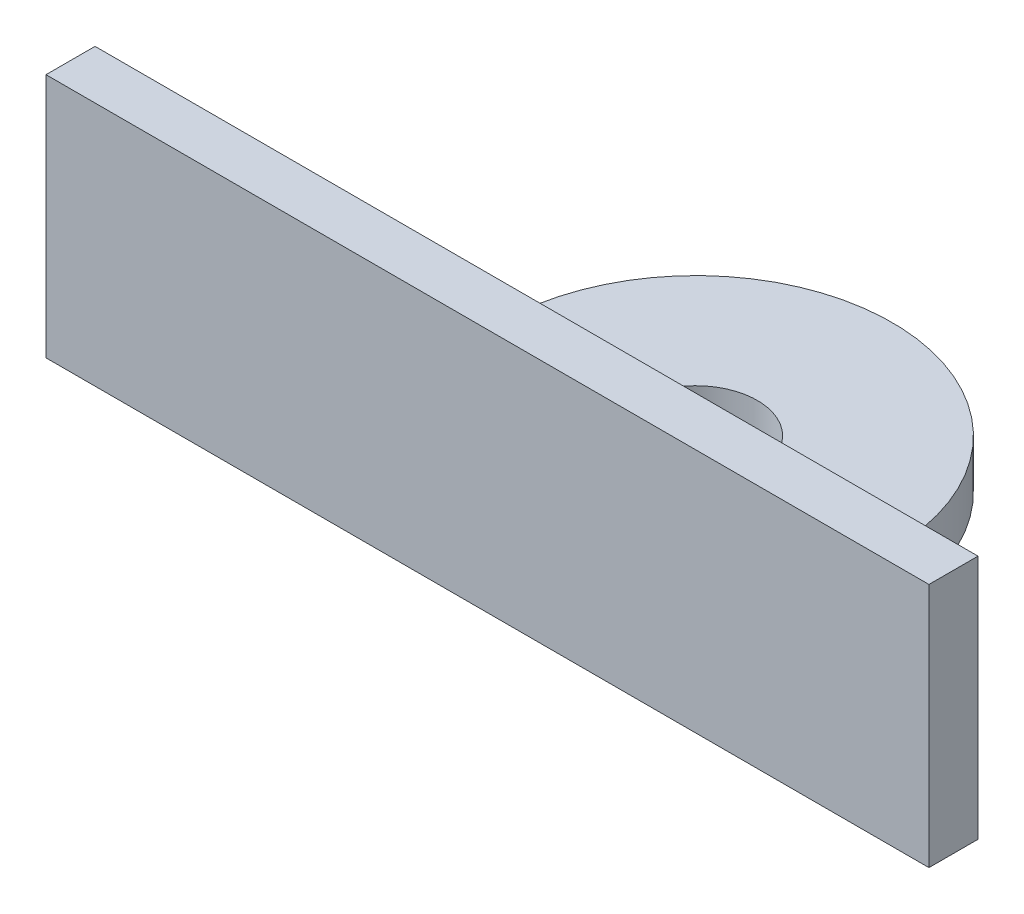
ISO-10303-21;
HEADER;
FILE_DESCRIPTION(('STEP AP214'),'2;1');
FILE_NAME('part.step','',(''),(''),'','','');
FILE_SCHEMA(('AUTOMOTIVE_DESIGN { 1 0 10303 214 1 1 1 1 }'));
ENDSEC;
DATA;
#1=APPLICATION_CONTEXT('core data for automotive mechanical design processes');
#2=APPLICATION_PROTOCOL_DEFINITION('international standard','automotive_design',2000,#1);
#3=PRODUCT_CONTEXT('',#1,'mechanical');
#4=PRODUCT('Part','Part','',(#3));
#5=PRODUCT_RELATED_PRODUCT_CATEGORY('part','',(#4));
#6=PRODUCT_DEFINITION_FORMATION('','',#4);
#7=PRODUCT_DEFINITION_CONTEXT('part definition',#1,'design');
#8=PRODUCT_DEFINITION('design','',#6,#7);
#9=PRODUCT_DEFINITION_SHAPE('','',#8);
#10=(LENGTH_UNIT() NAMED_UNIT(*) SI_UNIT(.MILLI.,.METRE.));
#11=(NAMED_UNIT(*) PLANE_ANGLE_UNIT() SI_UNIT($,.RADIAN.));
#12=(NAMED_UNIT(*) SI_UNIT($,.STERADIAN.) SOLID_ANGLE_UNIT());
#13=UNCERTAINTY_MEASURE_WITH_UNIT(LENGTH_MEASURE(1.E-05),#10,'distance_accuracy_value','');
#14=(GEOMETRIC_REPRESENTATION_CONTEXT(3) GLOBAL_UNCERTAINTY_ASSIGNED_CONTEXT((#13)) GLOBAL_UNIT_ASSIGNED_CONTEXT((#10,
#11,#12)) REPRESENTATION_CONTEXT('',''));
#15=CARTESIAN_POINT('',(0.,0.,0.));
#16=DIRECTION('',(0.,0.,1.));
#17=DIRECTION('',(1.,0.,0.));
#18=AXIS2_PLACEMENT_3D('',#15,#16,#17);
#19=CARTESIAN_POINT('',(0.,10.,-42.5));
#20=DIRECTION('',(0.,1.,0.));
#21=DIRECTION('',(0.,0.,1.));
#22=AXIS2_PLACEMENT_3D('',#19,#20,#21);
#23=PLANE('',#22);
#24=DIRECTION('',(-1.,0.,0.));
#25=VECTOR('',#24,1.);
#26=CARTESIAN_POINT('',(0.,10.,-10.));
#27=LINE('',#26,#25);
#28=CARTESIAN_POINT('',(40.,10.,-10.));
#29=VERTEX_POINT('',#28);
#30=CARTESIAN_POINT('',(-40.,10.,-10.));
#31=VERTEX_POINT('',#30);
#32=EDGE_CURVE('E138',#29,#31,#27,.T.);
#33=ORIENTED_EDGE('',*,*,#32,.F.);
#34=DIRECTION('',(0.,0.,-1.));
#35=VECTOR('',#34,1.);
#36=CARTESIAN_POINT('',(40.,10.,0.));
#37=LINE('',#36,#35);
#38=CARTESIAN_POINT('',(40.,10.,-42.5));
#39=VERTEX_POINT('',#38);
#40=EDGE_CURVE('E152',#29,#39,#37,.T.);
#41=ORIENTED_EDGE('',*,*,#40,.T.);
#42=CARTESIAN_POINT('',(0.,10.,-42.5));
#43=DIRECTION('',(0.,1.,0.));
#44=DIRECTION('',(0.,0.,1.));
#45=AXIS2_PLACEMENT_3D('',#42,#43,#44);
#46=CIRCLE('',#45,40.);
#47=CARTESIAN_POINT('',(-40.,10.,-42.5));
#48=VERTEX_POINT('',#47);
#49=EDGE_CURVE('E155',#39,#48,#46,.T.);
#50=ORIENTED_EDGE('',*,*,#49,.T.);
#51=DIRECTION('',(0.,0.,1.));
#52=VECTOR('',#51,1.);
#53=CARTESIAN_POINT('',(-40.,10.,-42.5));
#54=LINE('',#53,#52);
#55=EDGE_CURVE('E150',#48,#31,#54,.T.);
#56=ORIENTED_EDGE('',*,*,#55,.T.);
#57=EDGE_LOOP('',(#33,#41,#50,#56));
#58=FACE_BOUND('',#57,.T.);
#59=CARTESIAN_POINT('',(0.,10.,-42.5));
#60=DIRECTION('',(0.,1.,0.));
#61=DIRECTION('',(0.,0.,1.));
#62=AXIS2_PLACEMENT_3D('',#59,#60,#61);
#63=CIRCLE('',#62,12.5);
#64=CARTESIAN_POINT('',(0.,10.,-30.));
#65=VERTEX_POINT('',#64);
#66=EDGE_CURVE('E145',#65,#65,#63,.T.);
#67=ORIENTED_EDGE('',*,*,#66,.F.);
#68=EDGE_LOOP('',(#67));
#69=FACE_BOUND('',#68,.T.);
#70=ADVANCED_FACE('F33',(#58,#69),#23,.T.);
#71=CARTESIAN_POINT('',(0.,0.,-42.5));
#72=DIRECTION('',(0.,1.,0.));
#73=DIRECTION('',(0.,0.,1.));
#74=AXIS2_PLACEMENT_3D('',#71,#72,#73);
#75=PLANE('',#74);
#76=DIRECTION('',(0.,0.,-1.));
#77=VECTOR('',#76,1.);
#78=CARTESIAN_POINT('',(40.,0.,0.));
#79=LINE('',#78,#77);
#80=CARTESIAN_POINT('',(40.,0.,-10.));
#81=VERTEX_POINT('',#80);
#82=CARTESIAN_POINT('',(40.,0.,-42.5));
#83=VERTEX_POINT('',#82);
#84=EDGE_CURVE('E160',#81,#83,#79,.T.);
#85=ORIENTED_EDGE('',*,*,#84,.F.);
#86=DIRECTION('',(1.,0.,0.));
#87=VECTOR('',#86,1.);
#88=CARTESIAN_POINT('',(-90.,0.,-10.));
#89=LINE('',#88,#87);
#90=CARTESIAN_POINT('',(90.,0.,-10.));
#91=VERTEX_POINT('',#90);
#92=EDGE_CURVE('E120',#81,#91,#89,.T.);
#93=ORIENTED_EDGE('',*,*,#92,.T.);
#94=DIRECTION('',(0.,0.,1.));
#95=VECTOR('',#94,1.);
#96=CARTESIAN_POINT('',(90.,0.,-10.));
#97=LINE('',#96,#95);
#98=CARTESIAN_POINT('',(90.,0.,0.));
#99=VERTEX_POINT('',#98);
#100=EDGE_CURVE('E109',#91,#99,#97,.T.);
#101=ORIENTED_EDGE('',*,*,#100,.T.);
#102=DIRECTION('',(1.,0.,0.));
#103=VECTOR('',#102,1.);
#104=CARTESIAN_POINT('',(-40.,0.,0.));
#105=LINE('',#104,#103);
#106=CARTESIAN_POINT('',(-90.,0.,0.));
#107=VERTEX_POINT('',#106);
#108=EDGE_CURVE('E104',#107,#99,#105,.T.);
#109=ORIENTED_EDGE('',*,*,#108,.F.);
#110=DIRECTION('',(0.,0.,1.));
#111=VECTOR('',#110,1.);
#112=CARTESIAN_POINT('',(-90.,0.,-10.));
#113=LINE('',#112,#111);
#114=CARTESIAN_POINT('',(-90.,0.,-10.));
#115=VERTEX_POINT('',#114);
#116=EDGE_CURVE('E97',#115,#107,#113,.T.);
#117=ORIENTED_EDGE('',*,*,#116,.F.);
#118=CARTESIAN_POINT('',(-40.,0.,-10.));
#119=VERTEX_POINT('',#118);
#120=EDGE_CURVE('E102',#115,#119,#89,.T.);
#121=ORIENTED_EDGE('',*,*,#120,.T.);
#122=DIRECTION('',(0.,0.,1.));
#123=VECTOR('',#122,1.);
#124=CARTESIAN_POINT('',(-40.,0.,-42.5));
#125=LINE('',#124,#123);
#126=CARTESIAN_POINT('',(-40.,0.,-42.5));
#127=VERTEX_POINT('',#126);
#128=EDGE_CURVE('E53',#127,#119,#125,.T.);
#129=ORIENTED_EDGE('',*,*,#128,.F.);
#130=CARTESIAN_POINT('',(0.,0.,-42.5));
#131=DIRECTION('',(0.,1.,0.));
#132=DIRECTION('',(0.,0.,1.));
#133=AXIS2_PLACEMENT_3D('',#130,#131,#132);
#134=CIRCLE('',#133,40.);
#135=EDGE_CURVE('E153',#83,#127,#134,.T.);
#136=ORIENTED_EDGE('',*,*,#135,.F.);
#137=EDGE_LOOP('',(#85,#93,#101,#109,#117,#121,#129,#136));
#138=FACE_BOUND('',#137,.T.);
#139=CARTESIAN_POINT('',(0.,0.,-42.5));
#140=DIRECTION('',(0.,1.,0.));
#141=DIRECTION('',(0.,0.,1.));
#142=AXIS2_PLACEMENT_3D('',#139,#140,#141);
#143=CIRCLE('',#142,12.5);
#144=CARTESIAN_POINT('',(0.,0.,-30.));
#145=VERTEX_POINT('',#144);
#146=EDGE_CURVE('E144',#145,#145,#143,.T.);
#147=ORIENTED_EDGE('',*,*,#146,.T.);
#148=EDGE_LOOP('',(#147));
#149=FACE_BOUND('',#148,.T.);
#150=ADVANCED_FACE('F100',(#138,#149),#75,.F.);
#151=CARTESIAN_POINT('',(-40.,10.,-42.5));
#152=DIRECTION('',(1.,0.,0.));
#153=DIRECTION('',(0.,0.,-1.));
#154=AXIS2_PLACEMENT_3D('',#151,#152,#153);
#155=PLANE('',#154);
#156=ORIENTED_EDGE('',*,*,#128,.T.);
#157=DIRECTION('',(0.,1.,0.));
#158=VECTOR('',#157,1.);
#159=CARTESIAN_POINT('',(-40.,10.,-10.));
#160=LINE('',#159,#158);
#161=EDGE_CURVE('E48',#119,#31,#160,.T.);
#162=ORIENTED_EDGE('',*,*,#161,.T.);
#163=ORIENTED_EDGE('',*,*,#55,.F.);
#164=DIRECTION('',(0.,-1.,0.));
#165=VECTOR('',#164,1.);
#166=CARTESIAN_POINT('',(-40.,10.,-42.5));
#167=LINE('',#166,#165);
#168=EDGE_CURVE('E157',#48,#127,#167,.T.);
#169=ORIENTED_EDGE('',*,*,#168,.T.);
#170=EDGE_LOOP('',(#156,#162,#163,#169));
#171=FACE_BOUND('',#170,.T.);
#172=ADVANCED_FACE('F35',(#171),#155,.F.);
#173=CARTESIAN_POINT('',(-40.,10.,0.));
#174=DIRECTION('',(0.,0.,-1.));
#175=DIRECTION('',(-1.,0.,0.));
#176=AXIS2_PLACEMENT_3D('',#173,#174,#175);
#177=PLANE('',#176);
#178=DIRECTION('',(0.,-1.,0.));
#179=VECTOR('',#178,1.);
#180=CARTESIAN_POINT('',(-90.,0.,0.));
#181=LINE('',#180,#179);
#182=CARTESIAN_POINT('',(-90.,50.,0.));
#183=VERTEX_POINT('',#182);
#184=EDGE_CURVE('E133',#183,#107,#181,.T.);
#185=ORIENTED_EDGE('',*,*,#184,.T.);
#186=ORIENTED_EDGE('',*,*,#108,.T.);
#187=DIRECTION('',(0.,1.,0.));
#188=VECTOR('',#187,1.);
#189=CARTESIAN_POINT('',(90.,0.,0.));
#190=LINE('',#189,#188);
#191=CARTESIAN_POINT('',(90.,50.,0.));
#192=VERTEX_POINT('',#191);
#193=EDGE_CURVE('E127',#99,#192,#190,.T.);
#194=ORIENTED_EDGE('',*,*,#193,.T.);
#195=DIRECTION('',(-1.,0.,0.));
#196=VECTOR('',#195,1.);
#197=CARTESIAN_POINT('',(-90.,50.,0.));
#198=LINE('',#197,#196);
#199=EDGE_CURVE('E124',#192,#183,#198,.T.);
#200=ORIENTED_EDGE('',*,*,#199,.T.);
#201=EDGE_LOOP('',(#185,#186,#194,#200));
#202=FACE_BOUND('',#201,.T.);
#203=ADVANCED_FACE('F181',(#202),#177,.F.);
#204=CARTESIAN_POINT('',(40.,10.,0.));
#205=DIRECTION('',(-1.,0.,0.));
#206=DIRECTION('',(0.,0.,1.));
#207=AXIS2_PLACEMENT_3D('',#204,#205,#206);
#208=PLANE('',#207);
#209=ORIENTED_EDGE('',*,*,#40,.F.);
#210=DIRECTION('',(0.,-1.,0.));
#211=VECTOR('',#210,1.);
#212=CARTESIAN_POINT('',(40.,10.,-10.));
#213=LINE('',#212,#211);
#214=EDGE_CURVE('E11',#29,#81,#213,.T.);
#215=ORIENTED_EDGE('',*,*,#214,.T.);
#216=ORIENTED_EDGE('',*,*,#84,.T.);
#217=DIRECTION('',(0.,-1.,0.));
#218=VECTOR('',#217,1.);
#219=CARTESIAN_POINT('',(40.,10.,-42.5));
#220=LINE('',#219,#218);
#221=EDGE_CURVE('E41',#39,#83,#220,.T.);
#222=ORIENTED_EDGE('',*,*,#221,.F.);
#223=EDGE_LOOP('',(#209,#215,#216,#222));
#224=FACE_BOUND('',#223,.T.);
#225=ADVANCED_FACE('F206',(#224),#208,.F.);
#226=CARTESIAN_POINT('',(0.,10.,-42.5));
#227=DIRECTION('',(0.,-1.,0.));
#228=DIRECTION('',(0.,0.,-1.));
#229=AXIS2_PLACEMENT_3D('',#226,#227,#228);
#230=CYLINDRICAL_SURFACE('',#229,40.);
#231=ORIENTED_EDGE('',*,*,#135,.T.);
#232=ORIENTED_EDGE('',*,*,#168,.F.);
#233=ORIENTED_EDGE('',*,*,#49,.F.);
#234=ORIENTED_EDGE('',*,*,#221,.T.);
#235=EDGE_LOOP('',(#231,#232,#233,#234));
#236=FACE_BOUND('',#235,.T.);
#237=ADVANCED_FACE('F168',(#236),#230,.T.);
#238=CARTESIAN_POINT('',(0.,10.,-42.5));
#239=DIRECTION('',(0.,-1.,0.));
#240=DIRECTION('',(0.,0.,-1.));
#241=AXIS2_PLACEMENT_3D('',#238,#239,#240);
#242=CYLINDRICAL_SURFACE('',#241,12.5);
#243=ORIENTED_EDGE('',*,*,#66,.T.);
#244=EDGE_LOOP('',(#243));
#245=FACE_BOUND('',#244,.T.);
#246=ORIENTED_EDGE('',*,*,#146,.F.);
#247=EDGE_LOOP('',(#246));
#248=FACE_BOUND('',#247,.T.);
#249=ADVANCED_FACE('F202',(#245,#248),#242,.F.);
#250=CARTESIAN_POINT('',(0.,0.,-10.));
#251=DIRECTION('',(0.,0.,-1.));
#252=DIRECTION('',(-1.,0.,0.));
#253=AXIS2_PLACEMENT_3D('',#250,#251,#252);
#254=PLANE('',#253);
#255=ORIENTED_EDGE('',*,*,#161,.F.);
#256=ORIENTED_EDGE('',*,*,#120,.F.);
#257=DIRECTION('',(0.,-1.,0.));
#258=VECTOR('',#257,1.);
#259=CARTESIAN_POINT('',(-90.,0.,-10.));
#260=LINE('',#259,#258);
#261=CARTESIAN_POINT('',(-90.,50.,-10.));
#262=VERTEX_POINT('',#261);
#263=EDGE_CURVE('E116',#262,#115,#260,.T.);
#264=ORIENTED_EDGE('',*,*,#263,.F.);
#265=DIRECTION('',(-1.,0.,0.));
#266=VECTOR('',#265,1.);
#267=CARTESIAN_POINT('',(-90.,50.,-10.));
#268=LINE('',#267,#266);
#269=CARTESIAN_POINT('',(90.,50.,-10.));
#270=VERTEX_POINT('',#269);
#271=EDGE_CURVE('E110',#270,#262,#268,.T.);
#272=ORIENTED_EDGE('',*,*,#271,.F.);
#273=DIRECTION('',(0.,1.,0.));
#274=VECTOR('',#273,1.);
#275=CARTESIAN_POINT('',(90.,0.,-10.));
#276=LINE('',#275,#274);
#277=EDGE_CURVE('E119',#91,#270,#276,.T.);
#278=ORIENTED_EDGE('',*,*,#277,.F.);
#279=ORIENTED_EDGE('',*,*,#92,.F.);
#280=ORIENTED_EDGE('',*,*,#214,.F.);
#281=ORIENTED_EDGE('',*,*,#32,.T.);
#282=EDGE_LOOP('',(#255,#256,#264,#272,#278,#279,#280,#281));
#283=FACE_BOUND('',#282,.T.);
#284=ADVANCED_FACE('F114',(#283),#254,.T.);
#285=CARTESIAN_POINT('',(-90.,0.,-10.));
#286=DIRECTION('',(-1.,0.,0.));
#287=DIRECTION('',(0.,0.,1.));
#288=AXIS2_PLACEMENT_3D('',#285,#286,#287);
#289=PLANE('',#288);
#290=ORIENTED_EDGE('',*,*,#184,.F.);
#291=DIRECTION('',(0.,0.,1.));
#292=VECTOR('',#291,1.);
#293=CARTESIAN_POINT('',(-90.,50.,-10.));
#294=LINE('',#293,#292);
#295=EDGE_CURVE('E123',#262,#183,#294,.T.);
#296=ORIENTED_EDGE('',*,*,#295,.F.);
#297=ORIENTED_EDGE('',*,*,#263,.T.);
#298=ORIENTED_EDGE('',*,*,#116,.T.);
#299=EDGE_LOOP('',(#290,#296,#297,#298));
#300=FACE_BOUND('',#299,.T.);
#301=ADVANCED_FACE('F122',(#300),#289,.T.);
#302=CARTESIAN_POINT('',(-90.,50.,-10.));
#303=DIRECTION('',(0.,1.,0.));
#304=DIRECTION('',(0.,0.,1.));
#305=AXIS2_PLACEMENT_3D('',#302,#303,#304);
#306=PLANE('',#305);
#307=ORIENTED_EDGE('',*,*,#199,.F.);
#308=DIRECTION('',(0.,0.,1.));
#309=VECTOR('',#308,1.);
#310=CARTESIAN_POINT('',(90.,50.,-10.));
#311=LINE('',#310,#309);
#312=EDGE_CURVE('E139',#270,#192,#311,.T.);
#313=ORIENTED_EDGE('',*,*,#312,.F.);
#314=ORIENTED_EDGE('',*,*,#271,.T.);
#315=ORIENTED_EDGE('',*,*,#295,.T.);
#316=EDGE_LOOP('',(#307,#313,#314,#315));
#317=FACE_BOUND('',#316,.T.);
#318=ADVANCED_FACE('F183',(#317),#306,.T.);
#319=CARTESIAN_POINT('',(90.,0.,-10.));
#320=DIRECTION('',(1.,0.,0.));
#321=DIRECTION('',(0.,0.,-1.));
#322=AXIS2_PLACEMENT_3D('',#319,#320,#321);
#323=PLANE('',#322);
#324=ORIENTED_EDGE('',*,*,#193,.F.);
#325=ORIENTED_EDGE('',*,*,#100,.F.);
#326=ORIENTED_EDGE('',*,*,#277,.T.);
#327=ORIENTED_EDGE('',*,*,#312,.T.);
#328=EDGE_LOOP('',(#324,#325,#326,#327));
#329=FACE_BOUND('',#328,.T.);
#330=ADVANCED_FACE('F178',(#329),#323,.T.);
#331=CLOSED_SHELL('',(#70,#150,#172,#203,#225,#237,#249,#284,#301,#318,#330));
#332=MANIFOLD_SOLID_BREP('B2',#331);
#333=ADVANCED_BREP_SHAPE_REPRESENTATION('',(#18,#332),#14);
#334=SHAPE_DEFINITION_REPRESENTATION(#9,#333);
ENDSEC;
END-ISO-10303-21;
